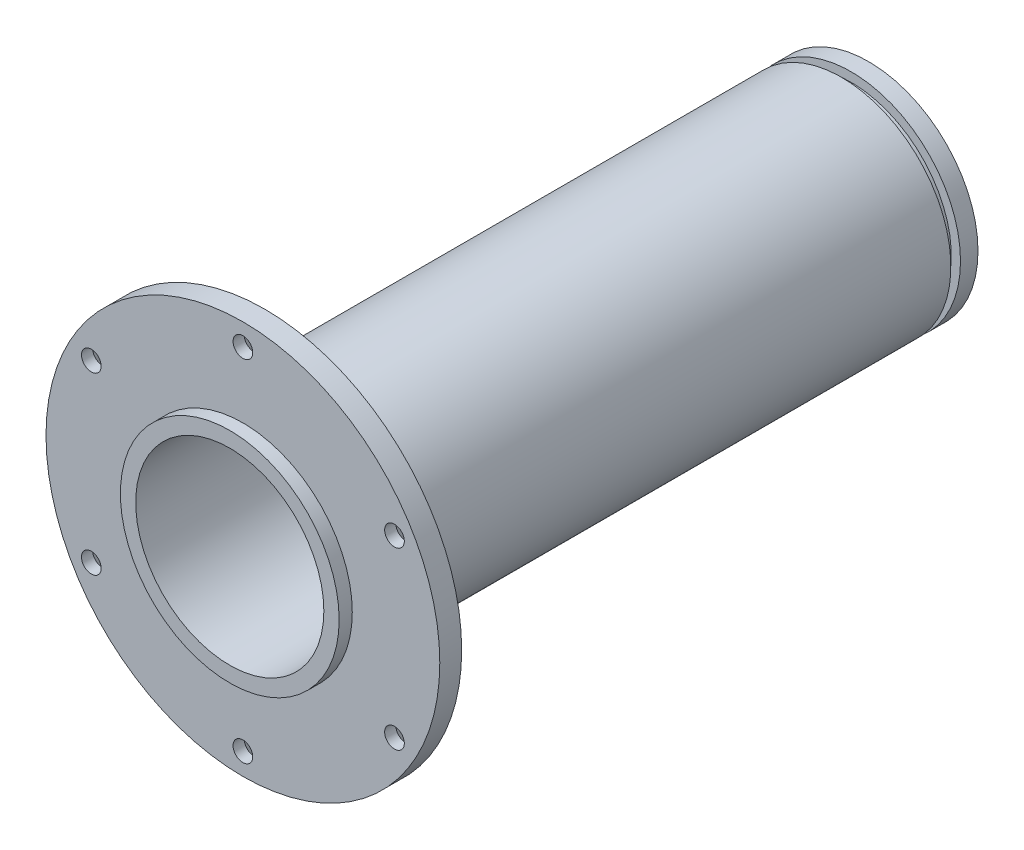
ISO-10303-21;
HEADER;
FILE_DESCRIPTION(('STEP AP214'),'2;1');
FILE_NAME('part.step','',(''),(''),'','','');
FILE_SCHEMA(('AUTOMOTIVE_DESIGN { 1 0 10303 214 1 1 1 1 }'));
ENDSEC;
DATA;
#1=APPLICATION_CONTEXT('core data for automotive mechanical design processes');
#2=APPLICATION_PROTOCOL_DEFINITION('international standard','automotive_design',2000,#1);
#3=PRODUCT_CONTEXT('',#1,'mechanical');
#4=PRODUCT('Part','Part','',(#3));
#5=PRODUCT_RELATED_PRODUCT_CATEGORY('part','',(#4));
#6=PRODUCT_DEFINITION_FORMATION('','',#4);
#7=PRODUCT_DEFINITION_CONTEXT('part definition',#1,'design');
#8=PRODUCT_DEFINITION('design','',#6,#7);
#9=PRODUCT_DEFINITION_SHAPE('','',#8);
#10=(LENGTH_UNIT() NAMED_UNIT(*) SI_UNIT(.MILLI.,.METRE.));
#11=(NAMED_UNIT(*) PLANE_ANGLE_UNIT() SI_UNIT($,.RADIAN.));
#12=(NAMED_UNIT(*) SI_UNIT($,.STERADIAN.) SOLID_ANGLE_UNIT());
#13=UNCERTAINTY_MEASURE_WITH_UNIT(LENGTH_MEASURE(1.E-05),#10,'distance_accuracy_value','');
#14=(GEOMETRIC_REPRESENTATION_CONTEXT(3) GLOBAL_UNCERTAINTY_ASSIGNED_CONTEXT((#13)) GLOBAL_UNIT_ASSIGNED_CONTEXT((#10,
#11,#12)) REPRESENTATION_CONTEXT('',''));
#15=CARTESIAN_POINT('',(0.,0.,0.));
#16=DIRECTION('',(0.,0.,1.));
#17=DIRECTION('',(1.,0.,0.));
#18=AXIS2_PLACEMENT_3D('',#15,#16,#17);
#19=CARTESIAN_POINT('',(0.,0.,-140.));
#20=DIRECTION('',(0.,0.,1.));
#21=DIRECTION('',(1.,0.,0.));
#22=AXIS2_PLACEMENT_3D('',#19,#20,#21);
#23=CYLINDRICAL_SURFACE('',#22,21.5);
#24=CARTESIAN_POINT('',(0.,0.,-3.));
#25=DIRECTION('',(0.,0.,1.));
#26=DIRECTION('',(1.,0.,0.));
#27=AXIS2_PLACEMENT_3D('',#24,#25,#26);
#28=CIRCLE('',#27,21.5);
#29=CARTESIAN_POINT('',(21.5,0.,-3.));
#30=VERTEX_POINT('',#29);
#31=EDGE_CURVE('E52',#30,#30,#28,.T.);
#32=ORIENTED_EDGE('',*,*,#31,.T.);
#33=EDGE_LOOP('',(#32));
#34=FACE_BOUND('',#33,.T.);
#35=CARTESIAN_POINT('',(0.,0.,-140.));
#36=DIRECTION('',(0.,0.,1.));
#37=DIRECTION('',(1.,0.,0.));
#38=AXIS2_PLACEMENT_3D('',#35,#36,#37);
#39=CIRCLE('',#38,21.5);
#40=CARTESIAN_POINT('',(21.5,0.,-140.));
#41=VERTEX_POINT('',#40);
#42=EDGE_CURVE('E146',#41,#41,#39,.T.);
#43=ORIENTED_EDGE('',*,*,#42,.F.);
#44=EDGE_LOOP('',(#43));
#45=FACE_BOUND('',#44,.T.);
#46=ADVANCED_FACE('F30',(#34,#45),#23,.F.);
#47=CARTESIAN_POINT('',(0.,0.,-6.));
#48=DIRECTION('',(0.,0.,1.));
#49=DIRECTION('',(1.,0.,0.));
#50=AXIS2_PLACEMENT_3D('',#47,#48,#49);
#51=CYLINDRICAL_SURFACE('',#50,25.);
#52=CARTESIAN_POINT('',(0.,0.,-6.));
#53=DIRECTION('',(0.,0.,1.));
#54=DIRECTION('',(1.,0.,0.));
#55=AXIS2_PLACEMENT_3D('',#52,#53,#54);
#56=CIRCLE('',#55,25.);
#57=CARTESIAN_POINT('',(25.,0.,-6.));
#58=VERTEX_POINT('',#57);
#59=EDGE_CURVE('E114',#58,#58,#56,.T.);
#60=ORIENTED_EDGE('',*,*,#59,.T.);
#61=EDGE_LOOP('',(#60));
#62=FACE_BOUND('',#61,.T.);
#63=CARTESIAN_POINT('',(0.,0.,-3.));
#64=DIRECTION('',(0.,0.,1.));
#65=DIRECTION('',(1.,0.,0.));
#66=AXIS2_PLACEMENT_3D('',#63,#64,#65);
#67=CIRCLE('',#66,25.);
#68=CARTESIAN_POINT('',(25.,0.,-3.));
#69=VERTEX_POINT('',#68);
#70=EDGE_CURVE('E101',#69,#69,#67,.T.);
#71=ORIENTED_EDGE('',*,*,#70,.F.);
#72=EDGE_LOOP('',(#71));
#73=FACE_BOUND('',#72,.T.);
#74=ADVANCED_FACE('F193',(#62,#73),#51,.T.);
#75=CARTESIAN_POINT('',(0.,0.,4.));
#76=DIRECTION('',(0.,0.,-1.));
#77=DIRECTION('',(-1.,0.,0.));
#78=AXIS2_PLACEMENT_3D('',#75,#76,#77);
#79=CYLINDRICAL_SURFACE('',#78,28.);
#80=CARTESIAN_POINT('',(0.,0.,-11.));
#81=DIRECTION('',(0.,0.,1.));
#82=DIRECTION('',(1.,0.,0.));
#83=AXIS2_PLACEMENT_3D('',#80,#81,#82);
#84=CIRCLE('',#83,28.);
#85=CARTESIAN_POINT('',(28.,0.,-11.));
#86=VERTEX_POINT('',#85);
#87=EDGE_CURVE('E10',#86,#86,#84,.T.);
#88=ORIENTED_EDGE('',*,*,#87,.F.);
#89=EDGE_LOOP('',(#88));
#90=FACE_BOUND('',#89,.T.);
#91=CARTESIAN_POINT('',(0.,0.,-19.));
#92=DIRECTION('',(0.,0.,-1.));
#93=DIRECTION('',(-1.,0.,0.));
#94=AXIS2_PLACEMENT_3D('',#91,#92,#93);
#95=CIRCLE('',#94,28.);
#96=CARTESIAN_POINT('',(-28.,0.,-19.));
#97=VERTEX_POINT('',#96);
#98=EDGE_CURVE('E107',#97,#97,#95,.T.);
#99=ORIENTED_EDGE('',*,*,#98,.F.);
#100=EDGE_LOOP('',(#99));
#101=FACE_BOUND('',#100,.T.);
#102=ADVANCED_FACE('F32',(#90,#101),#79,.T.);
#103=CARTESIAN_POINT('',(0.,0.,-149.));
#104=DIRECTION('',(0.,0.,1.));
#105=DIRECTION('',(1.,0.,0.));
#106=AXIS2_PLACEMENT_3D('',#103,#104,#105);
#107=CYLINDRICAL_SURFACE('',#106,25.);
#108=CARTESIAN_POINT('',(0.,0.,-142.8));
#109=DIRECTION('',(0.,0.,-1.));
#110=DIRECTION('',(-1.,0.,0.));
#111=AXIS2_PLACEMENT_3D('',#108,#109,#110);
#112=CIRCLE('',#111,25.);
#113=CARTESIAN_POINT('',(-25.,0.,-142.8));
#114=VERTEX_POINT('',#113);
#115=EDGE_CURVE('E126',#114,#114,#112,.T.);
#116=ORIENTED_EDGE('',*,*,#115,.F.);
#117=EDGE_LOOP('',(#116));
#118=FACE_BOUND('',#117,.T.);
#119=CARTESIAN_POINT('',(0.,0.,-19.));
#120=DIRECTION('',(0.,0.,-1.));
#121=DIRECTION('',(-1.,0.,0.));
#122=AXIS2_PLACEMENT_3D('',#119,#120,#121);
#123=CIRCLE('',#122,25.);
#124=CARTESIAN_POINT('',(-25.,0.,-19.));
#125=VERTEX_POINT('',#124);
#126=EDGE_CURVE('E104',#125,#125,#123,.T.);
#127=ORIENTED_EDGE('',*,*,#126,.T.);
#128=EDGE_LOOP('',(#127));
#129=FACE_BOUND('',#128,.T.);
#130=ADVANCED_FACE('F181',(#118,#129),#107,.T.);
#131=CARTESIAN_POINT('',(0.,0.,-99.));
#132=DIRECTION('',(0.,0.,-1.));
#133=DIRECTION('',(-1.,0.,0.));
#134=AXIS2_PLACEMENT_3D('',#131,#132,#133);
#135=CYLINDRICAL_SURFACE('',#134,14.);
#136=CARTESIAN_POINT('',(0.,0.,-149.));
#137=DIRECTION('',(0.,0.,-1.));
#138=DIRECTION('',(-1.,0.,0.));
#139=AXIS2_PLACEMENT_3D('',#136,#137,#138);
#140=CIRCLE('',#139,14.);
#141=CARTESIAN_POINT('',(-14.,0.,-149.));
#142=VERTEX_POINT('',#141);
#143=EDGE_CURVE('E43',#142,#142,#140,.T.);
#144=ORIENTED_EDGE('',*,*,#143,.T.);
#145=EDGE_LOOP('',(#144));
#146=FACE_BOUND('',#145,.T.);
#147=CARTESIAN_POINT('',(0.,0.,-140.));
#148=DIRECTION('',(0.,0.,1.));
#149=DIRECTION('',(1.,0.,0.));
#150=AXIS2_PLACEMENT_3D('',#147,#148,#149);
#151=CIRCLE('',#150,14.);
#152=CARTESIAN_POINT('',(14.,0.,-140.));
#153=VERTEX_POINT('',#152);
#154=EDGE_CURVE('E149',#153,#153,#151,.F.);
#155=ORIENTED_EDGE('',*,*,#154,.F.);
#156=EDGE_LOOP('',(#155));
#157=FACE_BOUND('',#156,.T.);
#158=ADVANCED_FACE('F178',(#146,#157),#135,.F.);
#159=CARTESIAN_POINT('',(0.,0.,-145.));
#160=DIRECTION('',(0.,0.,-1.));
#161=DIRECTION('',(-1.,0.,0.));
#162=AXIS2_PLACEMENT_3D('',#159,#160,#161);
#163=CIRCLE('',#162,25.);
#164=CARTESIAN_POINT('',(-25.,0.,-145.));
#165=VERTEX_POINT('',#164);
#166=EDGE_CURVE('E123',#165,#165,#163,.T.);
#167=ORIENTED_EDGE('',*,*,#166,.T.);
#168=EDGE_LOOP('',(#167));
#169=FACE_BOUND('',#168,.T.);
#170=CARTESIAN_POINT('',(0.,0.,-149.));
#171=DIRECTION('',(0.,0.,1.));
#172=DIRECTION('',(1.,0.,0.));
#173=AXIS2_PLACEMENT_3D('',#170,#171,#172);
#174=CIRCLE('',#173,25.);
#175=CARTESIAN_POINT('',(25.,0.,-149.));
#176=VERTEX_POINT('',#175);
#177=EDGE_CURVE('E38',#176,#176,#174,.T.);
#178=ORIENTED_EDGE('',*,*,#177,.T.);
#179=EDGE_LOOP('',(#178));
#180=FACE_BOUND('',#179,.T.);
#181=ADVANCED_FACE('F180',(#169,#180),#107,.T.);
#182=CARTESIAN_POINT('',(0.,0.,-149.));
#183=DIRECTION('',(0.,0.,1.));
#184=DIRECTION('',(1.,0.,0.));
#185=AXIS2_PLACEMENT_3D('',#182,#183,#184);
#186=PLANE('',#185);
#187=CARTESIAN_POINT('',(-1.8323016715005E-13,17.5,-149.));
#188=DIRECTION('',(0.,0.,-1.));
#189=DIRECTION('',(-1.,0.,0.));
#190=AXIS2_PLACEMENT_3D('',#187,#188,#189);
#191=CIRCLE('',#190,2.25);
#192=CARTESIAN_POINT('',(-2.25000000000018,17.5,-149.));
#193=VERTEX_POINT('',#192);
#194=EDGE_CURVE('E129',#193,#193,#191,.T.);
#195=ORIENTED_EDGE('',*,*,#194,.F.);
#196=EDGE_LOOP('',(#195));
#197=FACE_BOUND('',#196,.T.);
#198=CARTESIAN_POINT('',(17.5,1.22189584839116E-13,-149.));
#199=DIRECTION('',(0.,0.,-1.));
#200=DIRECTION('',(-1.,0.,0.));
#201=AXIS2_PLACEMENT_3D('',#198,#199,#200);
#202=CIRCLE('',#201,2.25);
#203=CARTESIAN_POINT('',(15.25,1.22189584839116E-13,-149.));
#204=VERTEX_POINT('',#203);
#205=EDGE_CURVE('E134',#204,#204,#202,.T.);
#206=ORIENTED_EDGE('',*,*,#205,.F.);
#207=EDGE_LOOP('',(#206));
#208=FACE_BOUND('',#207,.T.);
#209=CARTESIAN_POINT('',(0.,-17.5,-149.));
#210=DIRECTION('',(0.,0.,-1.));
#211=DIRECTION('',(-1.,0.,0.));
#212=AXIS2_PLACEMENT_3D('',#209,#210,#211);
#213=CIRCLE('',#212,2.24999999999994);
#214=CARTESIAN_POINT('',(-2.24999999999994,-17.5,-149.));
#215=VERTEX_POINT('',#214);
#216=EDGE_CURVE('E138',#215,#215,#213,.T.);
#217=ORIENTED_EDGE('',*,*,#216,.F.);
#218=EDGE_LOOP('',(#217));
#219=FACE_BOUND('',#218,.T.);
#220=CARTESIAN_POINT('',(-17.5,0.,-149.));
#221=DIRECTION('',(0.,0.,-1.));
#222=DIRECTION('',(-1.,0.,0.));
#223=AXIS2_PLACEMENT_3D('',#220,#221,#222);
#224=CIRCLE('',#223,2.24999999999998);
#225=CARTESIAN_POINT('',(-19.75,0.,-149.));
#226=VERTEX_POINT('',#225);
#227=EDGE_CURVE('E142',#226,#226,#224,.T.);
#228=ORIENTED_EDGE('',*,*,#227,.F.);
#229=EDGE_LOOP('',(#228));
#230=FACE_BOUND('',#229,.T.);
#231=ORIENTED_EDGE('',*,*,#143,.F.);
#232=EDGE_LOOP('',(#231));
#233=FACE_BOUND('',#232,.T.);
#234=ORIENTED_EDGE('',*,*,#177,.F.);
#235=EDGE_LOOP('',(#234));
#236=FACE_BOUND('',#235,.T.);
#237=ADVANCED_FACE('F167',(#197,#208,#219,#230,#233,#236),#186,.F.);
#238=CARTESIAN_POINT('',(0.,0.,-140.));
#239=DIRECTION('',(0.,0.,1.));
#240=DIRECTION('',(1.,0.,0.));
#241=AXIS2_PLACEMENT_3D('',#238,#239,#240);
#242=PLANE('',#241);
#243=CARTESIAN_POINT('',(-1.8323016715005E-13,17.5,-140.));
#244=DIRECTION('',(0.,0.,1.));
#245=DIRECTION('',(1.,0.,0.));
#246=AXIS2_PLACEMENT_3D('',#243,#244,#245);
#247=CIRCLE('',#246,2.25);
#248=CARTESIAN_POINT('',(2.24999999999982,17.5,-140.));
#249=VERTEX_POINT('',#248);
#250=EDGE_CURVE('E47',#249,#249,#247,.T.);
#251=ORIENTED_EDGE('',*,*,#250,.F.);
#252=EDGE_LOOP('',(#251));
#253=FACE_BOUND('',#252,.T.);
#254=CARTESIAN_POINT('',(17.5,1.22189584839116E-13,-140.));
#255=DIRECTION('',(0.,0.,1.));
#256=DIRECTION('',(1.,0.,0.));
#257=AXIS2_PLACEMENT_3D('',#254,#255,#256);
#258=CIRCLE('',#257,2.25);
#259=CARTESIAN_POINT('',(19.75,1.22189584839116E-13,-140.));
#260=VERTEX_POINT('',#259);
#261=EDGE_CURVE('E137',#260,#260,#258,.T.);
#262=ORIENTED_EDGE('',*,*,#261,.F.);
#263=EDGE_LOOP('',(#262));
#264=FACE_BOUND('',#263,.T.);
#265=CARTESIAN_POINT('',(0.,-17.5,-140.));
#266=DIRECTION('',(0.,0.,1.));
#267=DIRECTION('',(1.,0.,0.));
#268=AXIS2_PLACEMENT_3D('',#265,#266,#267);
#269=CIRCLE('',#268,2.24999999999994);
#270=CARTESIAN_POINT('',(2.24999999999994,-17.5,-140.));
#271=VERTEX_POINT('',#270);
#272=EDGE_CURVE('E141',#271,#271,#269,.T.);
#273=ORIENTED_EDGE('',*,*,#272,.F.);
#274=EDGE_LOOP('',(#273));
#275=FACE_BOUND('',#274,.T.);
#276=CARTESIAN_POINT('',(-17.5,0.,-140.));
#277=DIRECTION('',(0.,0.,1.));
#278=DIRECTION('',(1.,0.,0.));
#279=AXIS2_PLACEMENT_3D('',#276,#277,#278);
#280=CIRCLE('',#279,2.24999999999998);
#281=CARTESIAN_POINT('',(-15.25,0.,-140.));
#282=VERTEX_POINT('',#281);
#283=EDGE_CURVE('E145',#282,#282,#280,.T.);
#284=ORIENTED_EDGE('',*,*,#283,.F.);
#285=EDGE_LOOP('',(#284));
#286=FACE_BOUND('',#285,.T.);
#287=ORIENTED_EDGE('',*,*,#42,.T.);
#288=EDGE_LOOP('',(#287));
#289=FACE_BOUND('',#288,.T.);
#290=ORIENTED_EDGE('',*,*,#154,.T.);
#291=EDGE_LOOP('',(#290));
#292=FACE_BOUND('',#291,.T.);
#293=ADVANCED_FACE('F163',(#253,#264,#275,#286,#289,#292),#242,.T.);
#294=CARTESIAN_POINT('',(-17.5,0.,-131.));
#295=DIRECTION('',(0.,0.,-1.));
#296=DIRECTION('',(-1.,0.,0.));
#297=AXIS2_PLACEMENT_3D('',#294,#295,#296);
#298=CYLINDRICAL_SURFACE('',#297,2.24999999999998);
#299=ORIENTED_EDGE('',*,*,#283,.T.);
#300=EDGE_LOOP('',(#299));
#301=FACE_BOUND('',#300,.T.);
#302=ORIENTED_EDGE('',*,*,#227,.T.);
#303=EDGE_LOOP('',(#302));
#304=FACE_BOUND('',#303,.T.);
#305=ADVANCED_FACE('F166',(#301,#304),#298,.F.);
#306=CARTESIAN_POINT('',(0.,-17.5,-131.));
#307=DIRECTION('',(0.,0.,-1.));
#308=DIRECTION('',(-1.,0.,0.));
#309=AXIS2_PLACEMENT_3D('',#306,#307,#308);
#310=CYLINDRICAL_SURFACE('',#309,2.24999999999994);
#311=ORIENTED_EDGE('',*,*,#272,.T.);
#312=EDGE_LOOP('',(#311));
#313=FACE_BOUND('',#312,.T.);
#314=ORIENTED_EDGE('',*,*,#216,.T.);
#315=EDGE_LOOP('',(#314));
#316=FACE_BOUND('',#315,.T.);
#317=ADVANCED_FACE('F204',(#313,#316),#310,.F.);
#318=CARTESIAN_POINT('',(17.5,1.22189584839116E-13,-131.));
#319=DIRECTION('',(0.,0.,-1.));
#320=DIRECTION('',(-1.,0.,0.));
#321=AXIS2_PLACEMENT_3D('',#318,#319,#320);
#322=CYLINDRICAL_SURFACE('',#321,2.25);
#323=ORIENTED_EDGE('',*,*,#261,.T.);
#324=EDGE_LOOP('',(#323));
#325=FACE_BOUND('',#324,.T.);
#326=ORIENTED_EDGE('',*,*,#205,.T.);
#327=EDGE_LOOP('',(#326));
#328=FACE_BOUND('',#327,.T.);
#329=ADVANCED_FACE('F160',(#325,#328),#322,.F.);
#330=CARTESIAN_POINT('',(-1.8323016715005E-13,17.5,-131.));
#331=DIRECTION('',(0.,0.,-1.));
#332=DIRECTION('',(-1.,0.,0.));
#333=AXIS2_PLACEMENT_3D('',#330,#331,#332);
#334=CYLINDRICAL_SURFACE('',#333,2.25);
#335=ORIENTED_EDGE('',*,*,#250,.T.);
#336=EDGE_LOOP('',(#335));
#337=FACE_BOUND('',#336,.T.);
#338=ORIENTED_EDGE('',*,*,#194,.T.);
#339=EDGE_LOOP('',(#338));
#340=FACE_BOUND('',#339,.T.);
#341=ADVANCED_FACE('F211',(#337,#340),#334,.F.);
#342=CARTESIAN_POINT('',(0.,0.,-142.8));
#343=DIRECTION('',(0.,0.,-1.));
#344=DIRECTION('',(-1.,0.,0.));
#345=AXIS2_PLACEMENT_3D('',#342,#343,#344);
#346=PLANE('',#345);
#347=CARTESIAN_POINT('',(0.,0.,-142.8));
#348=DIRECTION('',(0.,0.,-1.));
#349=DIRECTION('',(-1.,0.,0.));
#350=AXIS2_PLACEMENT_3D('',#347,#348,#349);
#351=CIRCLE('',#350,22.9);
#352=CARTESIAN_POINT('',(-22.9,0.,-142.8));
#353=VERTEX_POINT('',#352);
#354=EDGE_CURVE('E120',#353,#353,#351,.T.);
#355=ORIENTED_EDGE('',*,*,#354,.F.);
#356=EDGE_LOOP('',(#355));
#357=FACE_BOUND('',#356,.T.);
#358=ORIENTED_EDGE('',*,*,#115,.T.);
#359=EDGE_LOOP('',(#358));
#360=FACE_BOUND('',#359,.T.);
#361=ADVANCED_FACE('F214',(#357,#360),#346,.T.);
#362=CARTESIAN_POINT('',(0.,0.,-145.));
#363=DIRECTION('',(0.,0.,-1.));
#364=DIRECTION('',(-1.,0.,0.));
#365=AXIS2_PLACEMENT_3D('',#362,#363,#364);
#366=PLANE('',#365);
#367=CARTESIAN_POINT('',(0.,0.,-145.));
#368=DIRECTION('',(0.,0.,-1.));
#369=DIRECTION('',(-1.,0.,0.));
#370=AXIS2_PLACEMENT_3D('',#367,#368,#369);
#371=CIRCLE('',#370,22.9);
#372=CARTESIAN_POINT('',(-22.9,0.,-145.));
#373=VERTEX_POINT('',#372);
#374=EDGE_CURVE('E119',#373,#373,#371,.T.);
#375=ORIENTED_EDGE('',*,*,#374,.T.);
#376=EDGE_LOOP('',(#375));
#377=FACE_BOUND('',#376,.T.);
#378=ORIENTED_EDGE('',*,*,#166,.F.);
#379=EDGE_LOOP('',(#378));
#380=FACE_BOUND('',#379,.T.);
#381=ADVANCED_FACE('F216',(#377,#380),#366,.F.);
#382=CARTESIAN_POINT('',(0.,0.,-142.8));
#383=DIRECTION('',(0.,0.,-1.));
#384=DIRECTION('',(-1.,0.,0.));
#385=AXIS2_PLACEMENT_3D('',#382,#383,#384);
#386=CYLINDRICAL_SURFACE('',#385,22.9);
#387=ORIENTED_EDGE('',*,*,#354,.T.);
#388=EDGE_LOOP('',(#387));
#389=FACE_BOUND('',#388,.T.);
#390=ORIENTED_EDGE('',*,*,#374,.F.);
#391=EDGE_LOOP('',(#390));
#392=FACE_BOUND('',#391,.T.);
#393=ADVANCED_FACE('F219',(#389,#392),#386,.T.);
#394=CARTESIAN_POINT('',(0.,0.,-6.));
#395=DIRECTION('',(0.,0.,1.));
#396=DIRECTION('',(1.,0.,0.));
#397=AXIS2_PLACEMENT_3D('',#394,#395,#396);
#398=PLANE('',#397);
#399=CARTESIAN_POINT('',(-34.6410161513776,-20.,-6.));
#400=DIRECTION('',(0.,0.,1.));
#401=DIRECTION('',(1.,0.,0.));
#402=AXIS2_PLACEMENT_3D('',#399,#400,#401);
#403=CIRCLE('',#402,2.24999999999999);
#404=CARTESIAN_POINT('',(-32.3910161513776,-20.,-6.));
#405=VERTEX_POINT('',#404);
#406=EDGE_CURVE('E34',#405,#405,#403,.T.);
#407=ORIENTED_EDGE('',*,*,#406,.F.);
#408=EDGE_LOOP('',(#407));
#409=FACE_BOUND('',#408,.T.);
#410=CARTESIAN_POINT('',(0.,-40.,-6.));
#411=DIRECTION('',(0.,0.,1.));
#412=DIRECTION('',(1.,0.,0.));
#413=AXIS2_PLACEMENT_3D('',#410,#411,#412);
#414=CIRCLE('',#413,2.24999999999999);
#415=CARTESIAN_POINT('',(2.24999999999997,-40.,-6.));
#416=VERTEX_POINT('',#415);
#417=EDGE_CURVE('E68',#416,#416,#414,.T.);
#418=ORIENTED_EDGE('',*,*,#417,.F.);
#419=EDGE_LOOP('',(#418));
#420=FACE_BOUND('',#419,.T.);
#421=CARTESIAN_POINT('',(34.6410161513775,-20.,-6.));
#422=DIRECTION('',(0.,0.,1.));
#423=DIRECTION('',(1.,0.,0.));
#424=AXIS2_PLACEMENT_3D('',#421,#422,#423);
#425=CIRCLE('',#424,2.24999999999999);
#426=CARTESIAN_POINT('',(36.8910161513775,-20.,-6.));
#427=VERTEX_POINT('',#426);
#428=EDGE_CURVE('E64',#427,#427,#425,.T.);
#429=ORIENTED_EDGE('',*,*,#428,.F.);
#430=EDGE_LOOP('',(#429));
#431=FACE_BOUND('',#430,.T.);
#432=CARTESIAN_POINT('',(34.6410161513776,20.,-6.));
#433=DIRECTION('',(0.,0.,1.));
#434=DIRECTION('',(1.,0.,0.));
#435=AXIS2_PLACEMENT_3D('',#432,#433,#434);
#436=CIRCLE('',#435,2.25);
#437=CARTESIAN_POINT('',(36.8910161513776,20.,-6.));
#438=VERTEX_POINT('',#437);
#439=EDGE_CURVE('E59',#438,#438,#436,.T.);
#440=ORIENTED_EDGE('',*,*,#439,.F.);
#441=EDGE_LOOP('',(#440));
#442=FACE_BOUND('',#441,.T.);
#443=CARTESIAN_POINT('',(0.,40.,-6.));
#444=DIRECTION('',(0.,0.,1.));
#445=DIRECTION('',(1.,0.,0.));
#446=AXIS2_PLACEMENT_3D('',#443,#444,#445);
#447=CIRCLE('',#446,2.24999999999999);
#448=CARTESIAN_POINT('',(2.25,40.,-6.));
#449=VERTEX_POINT('',#448);
#450=EDGE_CURVE('E54',#449,#449,#447,.T.);
#451=ORIENTED_EDGE('',*,*,#450,.F.);
#452=EDGE_LOOP('',(#451));
#453=FACE_BOUND('',#452,.T.);
#454=CARTESIAN_POINT('',(-34.6410161513775,20.,-6.));
#455=DIRECTION('',(0.,0.,1.));
#456=DIRECTION('',(1.,0.,0.));
#457=AXIS2_PLACEMENT_3D('',#454,#455,#456);
#458=CIRCLE('',#457,2.24999999999999);
#459=CARTESIAN_POINT('',(-32.3910161513775,20.,-6.));
#460=VERTEX_POINT('',#459);
#461=EDGE_CURVE('E49',#460,#460,#458,.T.);
#462=ORIENTED_EDGE('',*,*,#461,.F.);
#463=EDGE_LOOP('',(#462));
#464=FACE_BOUND('',#463,.T.);
#465=ORIENTED_EDGE('',*,*,#59,.F.);
#466=EDGE_LOOP('',(#465));
#467=FACE_BOUND('',#466,.T.);
#468=CARTESIAN_POINT('',(0.,0.,-6.));
#469=DIRECTION('',(0.,0.,1.));
#470=DIRECTION('',(1.,0.,0.));
#471=AXIS2_PLACEMENT_3D('',#468,#469,#470);
#472=CIRCLE('',#471,45.);
#473=CARTESIAN_POINT('',(45.,0.,-6.));
#474=VERTEX_POINT('',#473);
#475=EDGE_CURVE('E110',#474,#474,#472,.T.);
#476=ORIENTED_EDGE('',*,*,#475,.T.);
#477=EDGE_LOOP('',(#476));
#478=FACE_BOUND('',#477,.T.);
#479=ADVANCED_FACE('F226',(#409,#420,#431,#442,#453,#464,#467,#478),#398,.T.);
#480=CARTESIAN_POINT('',(0.,0.,-11.));
#481=DIRECTION('',(0.,0.,1.));
#482=DIRECTION('',(1.,0.,0.));
#483=AXIS2_PLACEMENT_3D('',#480,#481,#482);
#484=CYLINDRICAL_SURFACE('',#483,45.);
#485=CARTESIAN_POINT('',(0.,0.,-11.));
#486=DIRECTION('',(0.,0.,1.));
#487=DIRECTION('',(1.,0.,0.));
#488=AXIS2_PLACEMENT_3D('',#485,#486,#487);
#489=CIRCLE('',#488,45.);
#490=CARTESIAN_POINT('',(45.,0.,-11.));
#491=VERTEX_POINT('',#490);
#492=EDGE_CURVE('E111',#491,#491,#489,.T.);
#493=ORIENTED_EDGE('',*,*,#492,.T.);
#494=EDGE_LOOP('',(#493));
#495=FACE_BOUND('',#494,.T.);
#496=ORIENTED_EDGE('',*,*,#475,.F.);
#497=EDGE_LOOP('',(#496));
#498=FACE_BOUND('',#497,.T.);
#499=ADVANCED_FACE('F229',(#495,#498),#484,.T.);
#500=CARTESIAN_POINT('',(0.,0.,-11.));
#501=DIRECTION('',(0.,0.,1.));
#502=DIRECTION('',(1.,0.,0.));
#503=AXIS2_PLACEMENT_3D('',#500,#501,#502);
#504=PLANE('',#503);
#505=CARTESIAN_POINT('',(-34.6410161513776,-20.,-11.));
#506=DIRECTION('',(0.,0.,-1.));
#507=DIRECTION('',(-1.,0.,0.));
#508=AXIS2_PLACEMENT_3D('',#505,#506,#507);
#509=CIRCLE('',#508,4.7);
#510=CARTESIAN_POINT('',(-39.3410161513776,-20.,-11.));
#511=VERTEX_POINT('',#510);
#512=EDGE_CURVE('E301',#511,#511,#509,.T.);
#513=ORIENTED_EDGE('',*,*,#512,.F.);
#514=EDGE_LOOP('',(#513));
#515=FACE_BOUND('',#514,.T.);
#516=CARTESIAN_POINT('',(0.,-40.,-11.));
#517=DIRECTION('',(0.,0.,-1.));
#518=DIRECTION('',(-1.,0.,0.));
#519=AXIS2_PLACEMENT_3D('',#516,#517,#518);
#520=CIRCLE('',#519,4.7);
#521=CARTESIAN_POINT('',(-4.70000000000002,-40.,-11.));
#522=VERTEX_POINT('',#521);
#523=EDGE_CURVE('E77',#522,#522,#520,.T.);
#524=ORIENTED_EDGE('',*,*,#523,.F.);
#525=EDGE_LOOP('',(#524));
#526=FACE_BOUND('',#525,.T.);
#527=CARTESIAN_POINT('',(34.6410161513775,-20.,-11.));
#528=DIRECTION('',(0.,0.,-1.));
#529=DIRECTION('',(-1.,0.,0.));
#530=AXIS2_PLACEMENT_3D('',#527,#528,#529);
#531=CIRCLE('',#530,4.7);
#532=CARTESIAN_POINT('',(29.9410161513775,-20.,-11.));
#533=VERTEX_POINT('',#532);
#534=EDGE_CURVE('E70',#533,#533,#531,.T.);
#535=ORIENTED_EDGE('',*,*,#534,.F.);
#536=EDGE_LOOP('',(#535));
#537=FACE_BOUND('',#536,.T.);
#538=CARTESIAN_POINT('',(34.6410161513776,20.,-11.));
#539=DIRECTION('',(0.,0.,-1.));
#540=DIRECTION('',(-1.,0.,0.));
#541=AXIS2_PLACEMENT_3D('',#538,#539,#540);
#542=CIRCLE('',#541,4.7);
#543=CARTESIAN_POINT('',(29.9410161513776,20.,-11.));
#544=VERTEX_POINT('',#543);
#545=EDGE_CURVE('E66',#544,#544,#542,.T.);
#546=ORIENTED_EDGE('',*,*,#545,.F.);
#547=EDGE_LOOP('',(#546));
#548=FACE_BOUND('',#547,.T.);
#549=CARTESIAN_POINT('',(0.,40.,-11.));
#550=DIRECTION('',(0.,0.,-1.));
#551=DIRECTION('',(-1.,0.,0.));
#552=AXIS2_PLACEMENT_3D('',#549,#550,#551);
#553=CIRCLE('',#552,4.7);
#554=CARTESIAN_POINT('',(-4.69999999999999,40.,-11.));
#555=VERTEX_POINT('',#554);
#556=EDGE_CURVE('E62',#555,#555,#553,.T.);
#557=ORIENTED_EDGE('',*,*,#556,.F.);
#558=EDGE_LOOP('',(#557));
#559=FACE_BOUND('',#558,.T.);
#560=CARTESIAN_POINT('',(-34.6410161513775,20.,-11.));
#561=DIRECTION('',(0.,0.,-1.));
#562=DIRECTION('',(-1.,0.,0.));
#563=AXIS2_PLACEMENT_3D('',#560,#561,#562);
#564=CIRCLE('',#563,4.7);
#565=CARTESIAN_POINT('',(-39.3410161513775,20.,-11.));
#566=VERTEX_POINT('',#565);
#567=EDGE_CURVE('E57',#566,#566,#564,.T.);
#568=ORIENTED_EDGE('',*,*,#567,.F.);
#569=EDGE_LOOP('',(#568));
#570=FACE_BOUND('',#569,.T.);
#571=ORIENTED_EDGE('',*,*,#87,.T.);
#572=EDGE_LOOP('',(#571));
#573=FACE_BOUND('',#572,.T.);
#574=ORIENTED_EDGE('',*,*,#492,.F.);
#575=EDGE_LOOP('',(#574));
#576=FACE_BOUND('',#575,.T.);
#577=ADVANCED_FACE('F234',(#515,#526,#537,#548,#559,#570,#573,#576),#504,.F.);
#578=CARTESIAN_POINT('',(0.,0.,-19.));
#579=DIRECTION('',(0.,0.,-1.));
#580=DIRECTION('',(-1.,0.,0.));
#581=AXIS2_PLACEMENT_3D('',#578,#579,#580);
#582=PLANE('',#581);
#583=ORIENTED_EDGE('',*,*,#126,.F.);
#584=EDGE_LOOP('',(#583));
#585=FACE_BOUND('',#584,.T.);
#586=ORIENTED_EDGE('',*,*,#98,.T.);
#587=EDGE_LOOP('',(#586));
#588=FACE_BOUND('',#587,.T.);
#589=ADVANCED_FACE('F238',(#585,#588),#582,.T.);
#590=CARTESIAN_POINT('',(0.,0.,-3.));
#591=DIRECTION('',(0.,0.,1.));
#592=DIRECTION('',(1.,0.,0.));
#593=AXIS2_PLACEMENT_3D('',#590,#591,#592);
#594=PLANE('',#593);
#595=ORIENTED_EDGE('',*,*,#70,.T.);
#596=EDGE_LOOP('',(#595));
#597=FACE_BOUND('',#596,.T.);
#598=ORIENTED_EDGE('',*,*,#31,.F.);
#599=EDGE_LOOP('',(#598));
#600=FACE_BOUND('',#599,.T.);
#601=ADVANCED_FACE('F242',(#597,#600),#594,.T.);
#602=CARTESIAN_POINT('',(-34.6410161513775,20.,-11.));
#603=DIRECTION('',(0.,0.,-1.));
#604=DIRECTION('',(-1.,0.,0.));
#605=AXIS2_PLACEMENT_3D('',#602,#603,#604);
#606=CYLINDRICAL_SURFACE('',#605,2.24999999999999);
#607=ORIENTED_EDGE('',*,*,#461,.T.);
#608=EDGE_LOOP('',(#607));
#609=FACE_BOUND('',#608,.T.);
#610=CARTESIAN_POINT('',(-34.6410161513775,20.,-8.54999999999999));
#611=DIRECTION('',(0.,0.,-1.));
#612=DIRECTION('',(-1.,0.,0.));
#613=AXIS2_PLACEMENT_3D('',#610,#611,#612);
#614=CIRCLE('',#613,2.24999999999999);
#615=CARTESIAN_POINT('',(-36.8910161513775,20.,-8.54999999999999));
#616=VERTEX_POINT('',#615);
#617=EDGE_CURVE('E53',#616,#616,#614,.T.);
#618=ORIENTED_EDGE('',*,*,#617,.T.);
#619=EDGE_LOOP('',(#618));
#620=FACE_BOUND('',#619,.T.);
#621=ADVANCED_FACE('F246',(#609,#620),#606,.F.);
#622=CARTESIAN_POINT('',(-34.6410161513775,20.,-11.));
#623=DIRECTION('',(0.,0.,-1.));
#624=DIRECTION('',(-1.,0.,0.));
#625=AXIS2_PLACEMENT_3D('',#622,#623,#624);
#626=CONICAL_SURFACE('',#625,4.7,0.785398163397449);
#627=ORIENTED_EDGE('',*,*,#617,.F.);
#628=EDGE_LOOP('',(#627));
#629=FACE_BOUND('',#628,.T.);
#630=ORIENTED_EDGE('',*,*,#567,.T.);
#631=EDGE_LOOP('',(#630));
#632=FACE_BOUND('',#631,.T.);
#633=ADVANCED_FACE('F250',(#629,#632),#626,.F.);
#634=CARTESIAN_POINT('',(0.,40.,-11.));
#635=DIRECTION('',(0.,0.,-1.));
#636=DIRECTION('',(-1.,0.,0.));
#637=AXIS2_PLACEMENT_3D('',#634,#635,#636);
#638=CYLINDRICAL_SURFACE('',#637,2.24999999999999);
#639=ORIENTED_EDGE('',*,*,#450,.T.);
#640=EDGE_LOOP('',(#639));
#641=FACE_BOUND('',#640,.T.);
#642=CARTESIAN_POINT('',(0.,40.,-8.54999999999999));
#643=DIRECTION('',(0.,0.,-1.));
#644=DIRECTION('',(-1.,0.,0.));
#645=AXIS2_PLACEMENT_3D('',#642,#643,#644);
#646=CIRCLE('',#645,2.24999999999999);
#647=CARTESIAN_POINT('',(-2.24999999999998,40.,-8.54999999999999));
#648=VERTEX_POINT('',#647);
#649=EDGE_CURVE('E58',#648,#648,#646,.T.);
#650=ORIENTED_EDGE('',*,*,#649,.T.);
#651=EDGE_LOOP('',(#650));
#652=FACE_BOUND('',#651,.T.);
#653=ADVANCED_FACE('F254',(#641,#652),#638,.F.);
#654=CARTESIAN_POINT('',(0.,40.,-11.));
#655=DIRECTION('',(0.,0.,-1.));
#656=DIRECTION('',(-1.,0.,0.));
#657=AXIS2_PLACEMENT_3D('',#654,#655,#656);
#658=CONICAL_SURFACE('',#657,4.7,0.785398163397449);
#659=ORIENTED_EDGE('',*,*,#649,.F.);
#660=EDGE_LOOP('',(#659));
#661=FACE_BOUND('',#660,.T.);
#662=ORIENTED_EDGE('',*,*,#556,.T.);
#663=EDGE_LOOP('',(#662));
#664=FACE_BOUND('',#663,.T.);
#665=ADVANCED_FACE('F258',(#661,#664),#658,.F.);
#666=CARTESIAN_POINT('',(34.6410161513776,20.,-11.));
#667=DIRECTION('',(0.,0.,-1.));
#668=DIRECTION('',(-1.,0.,0.));
#669=AXIS2_PLACEMENT_3D('',#666,#667,#668);
#670=CYLINDRICAL_SURFACE('',#669,2.25);
#671=ORIENTED_EDGE('',*,*,#439,.T.);
#672=EDGE_LOOP('',(#671));
#673=FACE_BOUND('',#672,.T.);
#674=CARTESIAN_POINT('',(34.6410161513776,20.,-8.54999999999999));
#675=DIRECTION('',(0.,0.,-1.));
#676=DIRECTION('',(-1.,0.,0.));
#677=AXIS2_PLACEMENT_3D('',#674,#675,#676);
#678=CIRCLE('',#677,2.24999999999999);
#679=CARTESIAN_POINT('',(32.3910161513776,20.,-8.54999999999999));
#680=VERTEX_POINT('',#679);
#681=EDGE_CURVE('E63',#680,#680,#678,.T.);
#682=ORIENTED_EDGE('',*,*,#681,.T.);
#683=EDGE_LOOP('',(#682));
#684=FACE_BOUND('',#683,.T.);
#685=ADVANCED_FACE('F262',(#673,#684),#670,.F.);
#686=CARTESIAN_POINT('',(34.6410161513776,20.,-11.));
#687=DIRECTION('',(0.,0.,-1.));
#688=DIRECTION('',(-1.,0.,0.));
#689=AXIS2_PLACEMENT_3D('',#686,#687,#688);
#690=CONICAL_SURFACE('',#689,4.7,0.785398163397448);
#691=ORIENTED_EDGE('',*,*,#681,.F.);
#692=EDGE_LOOP('',(#691));
#693=FACE_BOUND('',#692,.T.);
#694=ORIENTED_EDGE('',*,*,#545,.T.);
#695=EDGE_LOOP('',(#694));
#696=FACE_BOUND('',#695,.T.);
#697=ADVANCED_FACE('F266',(#693,#696),#690,.F.);
#698=CARTESIAN_POINT('',(34.6410161513775,-20.,-11.));
#699=DIRECTION('',(0.,0.,-1.));
#700=DIRECTION('',(-1.,0.,0.));
#701=AXIS2_PLACEMENT_3D('',#698,#699,#700);
#702=CYLINDRICAL_SURFACE('',#701,2.24999999999999);
#703=ORIENTED_EDGE('',*,*,#428,.T.);
#704=EDGE_LOOP('',(#703));
#705=FACE_BOUND('',#704,.T.);
#706=CARTESIAN_POINT('',(34.6410161513775,-20.,-8.54999999999999));
#707=DIRECTION('',(0.,0.,-1.));
#708=DIRECTION('',(-1.,0.,0.));
#709=AXIS2_PLACEMENT_3D('',#706,#707,#708);
#710=CIRCLE('',#709,2.24999999999999);
#711=CARTESIAN_POINT('',(32.3910161513775,-20.,-8.54999999999999));
#712=VERTEX_POINT('',#711);
#713=EDGE_CURVE('E67',#712,#712,#710,.T.);
#714=ORIENTED_EDGE('',*,*,#713,.T.);
#715=EDGE_LOOP('',(#714));
#716=FACE_BOUND('',#715,.T.);
#717=ADVANCED_FACE('F270',(#705,#716),#702,.F.);
#718=CARTESIAN_POINT('',(34.6410161513775,-20.,-11.));
#719=DIRECTION('',(0.,0.,-1.));
#720=DIRECTION('',(-1.,0.,0.));
#721=AXIS2_PLACEMENT_3D('',#718,#719,#720);
#722=CONICAL_SURFACE('',#721,4.7,0.785398163397449);
#723=ORIENTED_EDGE('',*,*,#713,.F.);
#724=EDGE_LOOP('',(#723));
#725=FACE_BOUND('',#724,.T.);
#726=ORIENTED_EDGE('',*,*,#534,.T.);
#727=EDGE_LOOP('',(#726));
#728=FACE_BOUND('',#727,.T.);
#729=ADVANCED_FACE('F274',(#725,#728),#722,.F.);
#730=CARTESIAN_POINT('',(0.,-40.,-11.));
#731=DIRECTION('',(0.,0.,-1.));
#732=DIRECTION('',(-1.,0.,0.));
#733=AXIS2_PLACEMENT_3D('',#730,#731,#732);
#734=CYLINDRICAL_SURFACE('',#733,2.24999999999999);
#735=ORIENTED_EDGE('',*,*,#417,.T.);
#736=EDGE_LOOP('',(#735));
#737=FACE_BOUND('',#736,.T.);
#738=CARTESIAN_POINT('',(0.,-40.,-8.54999999999999));
#739=DIRECTION('',(0.,0.,-1.));
#740=DIRECTION('',(-1.,0.,0.));
#741=AXIS2_PLACEMENT_3D('',#738,#739,#740);
#742=CIRCLE('',#741,2.24999999999999);
#743=CARTESIAN_POINT('',(-2.25000000000001,-40.,-8.54999999999999));
#744=VERTEX_POINT('',#743);
#745=EDGE_CURVE('E71',#744,#744,#742,.T.);
#746=ORIENTED_EDGE('',*,*,#745,.T.);
#747=EDGE_LOOP('',(#746));
#748=FACE_BOUND('',#747,.T.);
#749=ADVANCED_FACE('F278',(#737,#748),#734,.F.);
#750=CARTESIAN_POINT('',(0.,-40.,-11.));
#751=DIRECTION('',(0.,0.,-1.));
#752=DIRECTION('',(-1.,0.,0.));
#753=AXIS2_PLACEMENT_3D('',#750,#751,#752);
#754=CONICAL_SURFACE('',#753,4.7,0.785398163397449);
#755=ORIENTED_EDGE('',*,*,#745,.F.);
#756=EDGE_LOOP('',(#755));
#757=FACE_BOUND('',#756,.T.);
#758=ORIENTED_EDGE('',*,*,#523,.T.);
#759=EDGE_LOOP('',(#758));
#760=FACE_BOUND('',#759,.T.);
#761=ADVANCED_FACE('F282',(#757,#760),#754,.F.);
#762=CARTESIAN_POINT('',(-34.6410161513776,-20.,-11.));
#763=DIRECTION('',(0.,0.,-1.));
#764=DIRECTION('',(-1.,0.,0.));
#765=AXIS2_PLACEMENT_3D('',#762,#763,#764);
#766=CYLINDRICAL_SURFACE('',#765,2.24999999999999);
#767=ORIENTED_EDGE('',*,*,#406,.T.);
#768=EDGE_LOOP('',(#767));
#769=FACE_BOUND('',#768,.T.);
#770=CARTESIAN_POINT('',(-34.6410161513776,-20.,-8.54999999999999));
#771=DIRECTION('',(0.,0.,-1.));
#772=DIRECTION('',(-1.,0.,0.));
#773=AXIS2_PLACEMENT_3D('',#770,#771,#772);
#774=CIRCLE('',#773,2.24999999999999);
#775=CARTESIAN_POINT('',(-36.8910161513775,-20.,-8.54999999999999));
#776=VERTEX_POINT('',#775);
#777=EDGE_CURVE('E298',#776,#776,#774,.T.);
#778=ORIENTED_EDGE('',*,*,#777,.T.);
#779=EDGE_LOOP('',(#778));
#780=FACE_BOUND('',#779,.T.);
#781=ADVANCED_FACE('F285',(#769,#780),#766,.F.);
#782=CARTESIAN_POINT('',(-34.6410161513776,-20.,-11.));
#783=DIRECTION('',(0.,0.,-1.));
#784=DIRECTION('',(-1.,0.,0.));
#785=AXIS2_PLACEMENT_3D('',#782,#783,#784);
#786=CONICAL_SURFACE('',#785,4.7,0.785398163397449);
#787=ORIENTED_EDGE('',*,*,#777,.F.);
#788=EDGE_LOOP('',(#787));
#789=FACE_BOUND('',#788,.T.);
#790=ORIENTED_EDGE('',*,*,#512,.T.);
#791=EDGE_LOOP('',(#790));
#792=FACE_BOUND('',#791,.T.);
#793=ADVANCED_FACE('F289',(#789,#792),#786,.F.);
#794=CLOSED_SHELL('',(#46,#74,#102,#130,#158,#181,#237,#293,#305,#317,#329,#341,#361,#381,#393,
#479,#499,#577,#589,#601,#621,#633,#653,#665,#685,#697,#717,#729,#749,#761,#781,#793));
#795=MANIFOLD_SOLID_BREP('B2',#794);
#796=ADVANCED_BREP_SHAPE_REPRESENTATION('',(#18,#795),#14);
#797=SHAPE_DEFINITION_REPRESENTATION(#9,#796);
ENDSEC;
END-ISO-10303-21;
